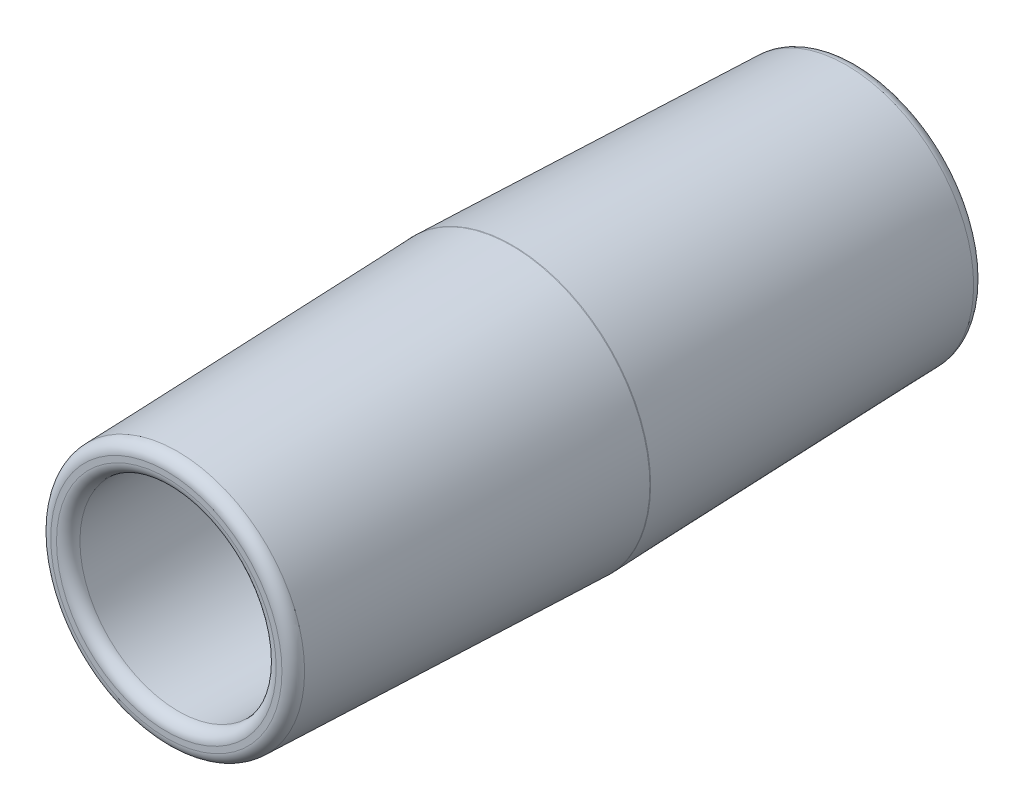
ISO-10303-21;
HEADER;
FILE_DESCRIPTION(('STEP AP214'),'2;1');
FILE_NAME('part.step','',(''),(''),'','','');
FILE_SCHEMA(('AUTOMOTIVE_DESIGN { 1 0 10303 214 1 1 1 1 }'));
ENDSEC;
DATA;
#1=APPLICATION_CONTEXT('core data for automotive mechanical design processes');
#2=APPLICATION_PROTOCOL_DEFINITION('international standard','automotive_design',2000,#1);
#3=PRODUCT_CONTEXT('',#1,'mechanical');
#4=PRODUCT('Part','Part','',(#3));
#5=PRODUCT_RELATED_PRODUCT_CATEGORY('part','',(#4));
#6=PRODUCT_DEFINITION_FORMATION('','',#4);
#7=PRODUCT_DEFINITION_CONTEXT('part definition',#1,'design');
#8=PRODUCT_DEFINITION('design','',#6,#7);
#9=PRODUCT_DEFINITION_SHAPE('','',#8);
#10=(LENGTH_UNIT() NAMED_UNIT(*) SI_UNIT(.MILLI.,.METRE.));
#11=(NAMED_UNIT(*) PLANE_ANGLE_UNIT() SI_UNIT($,.RADIAN.));
#12=(NAMED_UNIT(*) SI_UNIT($,.STERADIAN.) SOLID_ANGLE_UNIT());
#13=UNCERTAINTY_MEASURE_WITH_UNIT(LENGTH_MEASURE(1.E-05),#10,'distance_accuracy_value','');
#14=(GEOMETRIC_REPRESENTATION_CONTEXT(3) GLOBAL_UNCERTAINTY_ASSIGNED_CONTEXT((#13)) GLOBAL_UNIT_ASSIGNED_CONTEXT((#10,
#11,#12)) REPRESENTATION_CONTEXT('',''));
#15=CARTESIAN_POINT('',(0.,0.,0.));
#16=DIRECTION('',(0.,0.,1.));
#17=DIRECTION('',(1.,0.,0.));
#18=AXIS2_PLACEMENT_3D('',#15,#16,#17);
#19=CARTESIAN_POINT('',(11.,0.,-30.));
#20=DIRECTION('',(0.,0.,1.));
#21=DIRECTION('',(1.,0.,0.));
#22=AXIS2_PLACEMENT_3D('',#19,#20,#21);
#23=PLANE('',#22);
#24=CARTESIAN_POINT('',(0.,0.,-30.));
#25=DIRECTION('',(0.,0.,1.));
#26=DIRECTION('',(1.,0.,0.));
#27=AXIS2_PLACEMENT_3D('',#24,#25,#26);
#28=CIRCLE('',#27,9.53388873465358);
#29=CARTESIAN_POINT('',(9.53388873465358,0.,-30.));
#30=VERTEX_POINT('',#29);
#31=EDGE_CURVE('E54',#30,#30,#28,.T.);
#32=ORIENTED_EDGE('',*,*,#31,.T.);
#33=EDGE_LOOP('',(#32));
#34=FACE_BOUND('',#33,.T.);
#35=CARTESIAN_POINT('',(0.,0.,-30.));
#36=DIRECTION('',(0.,0.,1.));
#37=DIRECTION('',(1.,0.,0.));
#38=AXIS2_PLACEMENT_3D('',#35,#36,#37);
#39=CIRCLE('',#38,10.0327779320131);
#40=CARTESIAN_POINT('',(10.0327779320131,0.,-30.));
#41=VERTEX_POINT('',#40);
#42=EDGE_CURVE('E57',#41,#41,#39,.F.);
#43=ORIENTED_EDGE('',*,*,#42,.T.);
#44=EDGE_LOOP('',(#43));
#45=FACE_BOUND('',#44,.T.);
#46=ADVANCED_FACE('F31',(#34,#45),#23,.F.);
#47=CARTESIAN_POINT('',(0.,0.,-30.));
#48=DIRECTION('',(0.,0.,1.));
#49=DIRECTION('',(1.,0.,0.));
#50=AXIS2_PLACEMENT_3D('',#47,#48,#49);
#51=CONICAL_SURFACE('',#50,8.5,0.0333209958782473);
#52=CARTESIAN_POINT('',(0.,0.,-0.0333148302326384));
#53=DIRECTION('',(0.,0.,1.));
#54=DIRECTION('',(1.,0.,0.));
#55=AXIS2_PLACEMENT_3D('',#52,#53,#54);
#56=CIRCLE('',#55,9.49888950565891);
#57=CARTESIAN_POINT('',(9.49888950565891,0.,-0.0333148302326384));
#58=VERTEX_POINT('',#57);
#59=EDGE_CURVE('E10',#58,#58,#56,.T.);
#60=ORIENTED_EDGE('',*,*,#59,.T.);
#61=EDGE_LOOP('',(#60));
#62=FACE_BOUND('',#61,.T.);
#63=CARTESIAN_POINT('',(0.,0.,-28.9666851697674));
#64=DIRECTION('',(0.,0.,-1.));
#65=DIRECTION('',(-1.,0.,0.));
#66=AXIS2_PLACEMENT_3D('',#63,#64,#65);
#67=CIRCLE('',#66,8.53444382767442);
#68=CARTESIAN_POINT('',(-8.53444382767442,0.,-28.9666851697674));
#69=VERTEX_POINT('',#68);
#70=EDGE_CURVE('E60',#69,#69,#67,.T.);
#71=ORIENTED_EDGE('',*,*,#70,.T.);
#72=EDGE_LOOP('',(#71));
#73=FACE_BOUND('',#72,.T.);
#74=ADVANCED_FACE('F87',(#62,#73),#51,.F.);
#75=CARTESIAN_POINT('',(0.,0.,0.));
#76=DIRECTION('',(0.,0.,-1.));
#77=DIRECTION('',(-1.,0.,0.));
#78=AXIS2_PLACEMENT_3D('',#75,#76,#77);
#79=CONICAL_SURFACE('',#78,9.50000000000001,0.0333209958782471);
#80=CARTESIAN_POINT('',(0.,0.,0.0333148302326383));
#81=DIRECTION('',(0.,0.,-1.));
#82=DIRECTION('',(-1.,0.,0.));
#83=AXIS2_PLACEMENT_3D('',#80,#81,#82);
#84=CIRCLE('',#83,9.49888950565892);
#85=CARTESIAN_POINT('',(-9.49888950565892,0.,0.0333148302326383));
#86=VERTEX_POINT('',#85);
#87=EDGE_CURVE('E38',#86,#86,#84,.T.);
#88=ORIENTED_EDGE('',*,*,#87,.T.);
#89=EDGE_LOOP('',(#88));
#90=FACE_BOUND('',#89,.T.);
#91=CARTESIAN_POINT('',(0.,0.,28.9666851697674));
#92=DIRECTION('',(0.,0.,1.));
#93=DIRECTION('',(1.,0.,0.));
#94=AXIS2_PLACEMENT_3D('',#91,#92,#93);
#95=CIRCLE('',#94,8.53444382767443);
#96=CARTESIAN_POINT('',(8.53444382767443,0.,28.9666851697674));
#97=VERTEX_POINT('',#96);
#98=EDGE_CURVE('E42',#97,#97,#95,.T.);
#99=ORIENTED_EDGE('',*,*,#98,.T.);
#100=EDGE_LOOP('',(#99));
#101=FACE_BOUND('',#100,.T.);
#102=ADVANCED_FACE('F94',(#90,#101),#79,.F.);
#103=CARTESIAN_POINT('',(8.50000000000001,0.,30.));
#104=DIRECTION('',(0.,0.,-1.));
#105=DIRECTION('',(-1.,0.,0.));
#106=AXIS2_PLACEMENT_3D('',#103,#104,#105);
#107=PLANE('',#106);
#108=CARTESIAN_POINT('',(0.,0.,30.));
#109=DIRECTION('',(0.,0.,-1.));
#110=DIRECTION('',(-1.,0.,0.));
#111=AXIS2_PLACEMENT_3D('',#108,#109,#110);
#112=CIRCLE('',#111,9.53388873465358);
#113=CARTESIAN_POINT('',(-9.53388873465358,0.,30.));
#114=VERTEX_POINT('',#113);
#115=EDGE_CURVE('E46',#114,#114,#112,.T.);
#116=ORIENTED_EDGE('',*,*,#115,.T.);
#117=EDGE_LOOP('',(#116));
#118=FACE_BOUND('',#117,.T.);
#119=CARTESIAN_POINT('',(0.,0.,30.));
#120=DIRECTION('',(0.,0.,-1.));
#121=DIRECTION('',(-1.,0.,0.));
#122=AXIS2_PLACEMENT_3D('',#119,#120,#121);
#123=CIRCLE('',#122,10.0327779320131);
#124=CARTESIAN_POINT('',(-10.0327779320131,0.,30.));
#125=VERTEX_POINT('',#124);
#126=EDGE_CURVE('E51',#125,#125,#123,.F.);
#127=ORIENTED_EDGE('',*,*,#126,.T.);
#128=EDGE_LOOP('',(#127));
#129=FACE_BOUND('',#128,.T.);
#130=ADVANCED_FACE('F120',(#118,#129),#107,.F.);
#131=CARTESIAN_POINT('',(0.,0.,30.));
#132=DIRECTION('',(0.,0.,-1.));
#133=DIRECTION('',(-1.,0.,0.));
#134=AXIS2_PLACEMENT_3D('',#131,#132,#133);
#135=CONICAL_SURFACE('',#134,11.,0.0333209958782469);
#136=CARTESIAN_POINT('',(0.,0.,0.0333148302326669));
#137=DIRECTION('',(0.,0.,1.));
#138=DIRECTION('',(1.,0.,0.));
#139=AXIS2_PLACEMENT_3D('',#136,#137,#138);
#140=CIRCLE('',#139,11.9988895056589);
#141=CARTESIAN_POINT('',(11.9988895056589,0.,0.0333148302326669));
#142=VERTEX_POINT('',#141);
#143=EDGE_CURVE('E63',#142,#142,#140,.T.);
#144=ORIENTED_EDGE('',*,*,#143,.T.);
#145=EDGE_LOOP('',(#144));
#146=FACE_BOUND('',#145,.T.);
#147=CARTESIAN_POINT('',(0.,0.,29.0333148302326));
#148=DIRECTION('',(0.,0.,1.));
#149=DIRECTION('',(1.,0.,0.));
#150=AXIS2_PLACEMENT_3D('',#147,#148,#149);
#151=CIRCLE('',#150,11.0322228389923);
#152=CARTESIAN_POINT('',(11.0322228389923,0.,29.0333148302326));
#153=VERTEX_POINT('',#152);
#154=EDGE_CURVE('E66',#153,#153,#151,.F.);
#155=ORIENTED_EDGE('',*,*,#154,.T.);
#156=EDGE_LOOP('',(#155));
#157=FACE_BOUND('',#156,.T.);
#158=ADVANCED_FACE('F118',(#146,#157),#135,.T.);
#159=CARTESIAN_POINT('',(0.,0.,0.));
#160=DIRECTION('',(0.,0.,1.));
#161=DIRECTION('',(1.,0.,0.));
#162=AXIS2_PLACEMENT_3D('',#159,#160,#161);
#163=CONICAL_SURFACE('',#162,12.,0.0333209958782474);
#164=CARTESIAN_POINT('',(0.,0.,-0.0333148302326669));
#165=DIRECTION('',(0.,0.,-1.));
#166=DIRECTION('',(-1.,0.,0.));
#167=AXIS2_PLACEMENT_3D('',#164,#165,#166);
#168=CIRCLE('',#167,11.9988895056589);
#169=CARTESIAN_POINT('',(-11.9988895056589,0.,-0.0333148302326669));
#170=VERTEX_POINT('',#169);
#171=EDGE_CURVE('E69',#170,#170,#168,.T.);
#172=ORIENTED_EDGE('',*,*,#171,.T.);
#173=EDGE_LOOP('',(#172));
#174=FACE_BOUND('',#173,.T.);
#175=CARTESIAN_POINT('',(0.,0.,-29.0333148302326));
#176=DIRECTION('',(0.,0.,-1.));
#177=DIRECTION('',(-1.,0.,0.));
#178=AXIS2_PLACEMENT_3D('',#175,#176,#177);
#179=CIRCLE('',#178,11.0322228389922);
#180=CARTESIAN_POINT('',(-11.0322228389922,0.,-29.0333148302326));
#181=VERTEX_POINT('',#180);
#182=EDGE_CURVE('E72',#181,#181,#179,.F.);
#183=ORIENTED_EDGE('',*,*,#182,.T.);
#184=EDGE_LOOP('',(#183));
#185=FACE_BOUND('',#184,.T.);
#186=ADVANCED_FACE('F76',(#174,#185),#163,.T.);
#187=CARTESIAN_POINT('',(0.,0.,0.));
#188=DIRECTION('',(0.,0.,1.));
#189=DIRECTION('',(1.,0.,0.));
#190=AXIS2_PLACEMENT_3D('',#187,#188,#189);
#191=TOROIDAL_SURFACE('',#190,10.9994445986798,1.);
#192=ORIENTED_EDGE('',*,*,#143,.F.);
#193=EDGE_LOOP('',(#192));
#194=FACE_BOUND('',#193,.T.);
#195=ORIENTED_EDGE('',*,*,#171,.F.);
#196=EDGE_LOOP('',(#195));
#197=FACE_BOUND('',#196,.T.);
#198=ADVANCED_FACE('F98',(#194,#197),#191,.T.);
#199=CARTESIAN_POINT('',(0.,0.,-29.));
#200=DIRECTION('',(0.,0.,1.));
#201=DIRECTION('',(1.,0.,0.));
#202=AXIS2_PLACEMENT_3D('',#199,#200,#201);
#203=TOROIDAL_SURFACE('',#202,9.53388873465358,1.);
#204=ORIENTED_EDGE('',*,*,#31,.F.);
#205=EDGE_LOOP('',(#204));
#206=FACE_BOUND('',#205,.T.);
#207=ORIENTED_EDGE('',*,*,#70,.F.);
#208=EDGE_LOOP('',(#207));
#209=FACE_BOUND('',#208,.T.);
#210=ADVANCED_FACE('F82',(#206,#209),#203,.T.);
#211=CARTESIAN_POINT('',(0.,0.,-29.));
#212=DIRECTION('',(0.,0.,1.));
#213=DIRECTION('',(1.,0.,0.));
#214=AXIS2_PLACEMENT_3D('',#211,#212,#213);
#215=TOROIDAL_SURFACE('',#214,10.0327779320131,1.);
#216=ORIENTED_EDGE('',*,*,#182,.F.);
#217=EDGE_LOOP('',(#216));
#218=FACE_BOUND('',#217,.T.);
#219=ORIENTED_EDGE('',*,*,#42,.F.);
#220=EDGE_LOOP('',(#219));
#221=FACE_BOUND('',#220,.T.);
#222=ADVANCED_FACE('F78',(#218,#221),#215,.T.);
#223=CARTESIAN_POINT('',(0.,0.,29.));
#224=DIRECTION('',(0.,0.,-1.));
#225=DIRECTION('',(-1.,0.,0.));
#226=AXIS2_PLACEMENT_3D('',#223,#224,#225);
#227=TOROIDAL_SURFACE('',#226,9.53388873465358,1.);
#228=ORIENTED_EDGE('',*,*,#98,.F.);
#229=EDGE_LOOP('',(#228));
#230=FACE_BOUND('',#229,.T.);
#231=ORIENTED_EDGE('',*,*,#115,.F.);
#232=EDGE_LOOP('',(#231));
#233=FACE_BOUND('',#232,.T.);
#234=ADVANCED_FACE('F81',(#230,#233),#227,.T.);
#235=CARTESIAN_POINT('',(0.,0.,29.));
#236=DIRECTION('',(0.,0.,-1.));
#237=DIRECTION('',(-1.,0.,0.));
#238=AXIS2_PLACEMENT_3D('',#235,#236,#237);
#239=TOROIDAL_SURFACE('',#238,10.0327779320131,1.);
#240=ORIENTED_EDGE('',*,*,#126,.F.);
#241=EDGE_LOOP('',(#240));
#242=FACE_BOUND('',#241,.T.);
#243=ORIENTED_EDGE('',*,*,#154,.F.);
#244=EDGE_LOOP('',(#243));
#245=FACE_BOUND('',#244,.T.);
#246=ADVANCED_FACE('F106',(#242,#245),#239,.T.);
#247=CARTESIAN_POINT('',(0.,0.,0.));
#248=DIRECTION('',(0.,0.,-1.));
#249=DIRECTION('',(-1.,0.,0.));
#250=AXIS2_PLACEMENT_3D('',#247,#248,#249);
#251=TOROIDAL_SURFACE('',#250,8.49944459867976,1.);
#252=ORIENTED_EDGE('',*,*,#59,.F.);
#253=EDGE_LOOP('',(#252));
#254=FACE_BOUND('',#253,.T.);
#255=ORIENTED_EDGE('',*,*,#87,.F.);
#256=EDGE_LOOP('',(#255));
#257=FACE_BOUND('',#256,.T.);
#258=ADVANCED_FACE('F33',(#254,#257),#251,.F.);
#259=CLOSED_SHELL('',(#46,#74,#102,#130,#158,#186,#198,#210,#222,#234,#246,#258));
#260=MANIFOLD_SOLID_BREP('B2',#259);
#261=ADVANCED_BREP_SHAPE_REPRESENTATION('',(#18,#260),#14);
#262=SHAPE_DEFINITION_REPRESENTATION(#9,#261);
ENDSEC;
END-ISO-10303-21;
